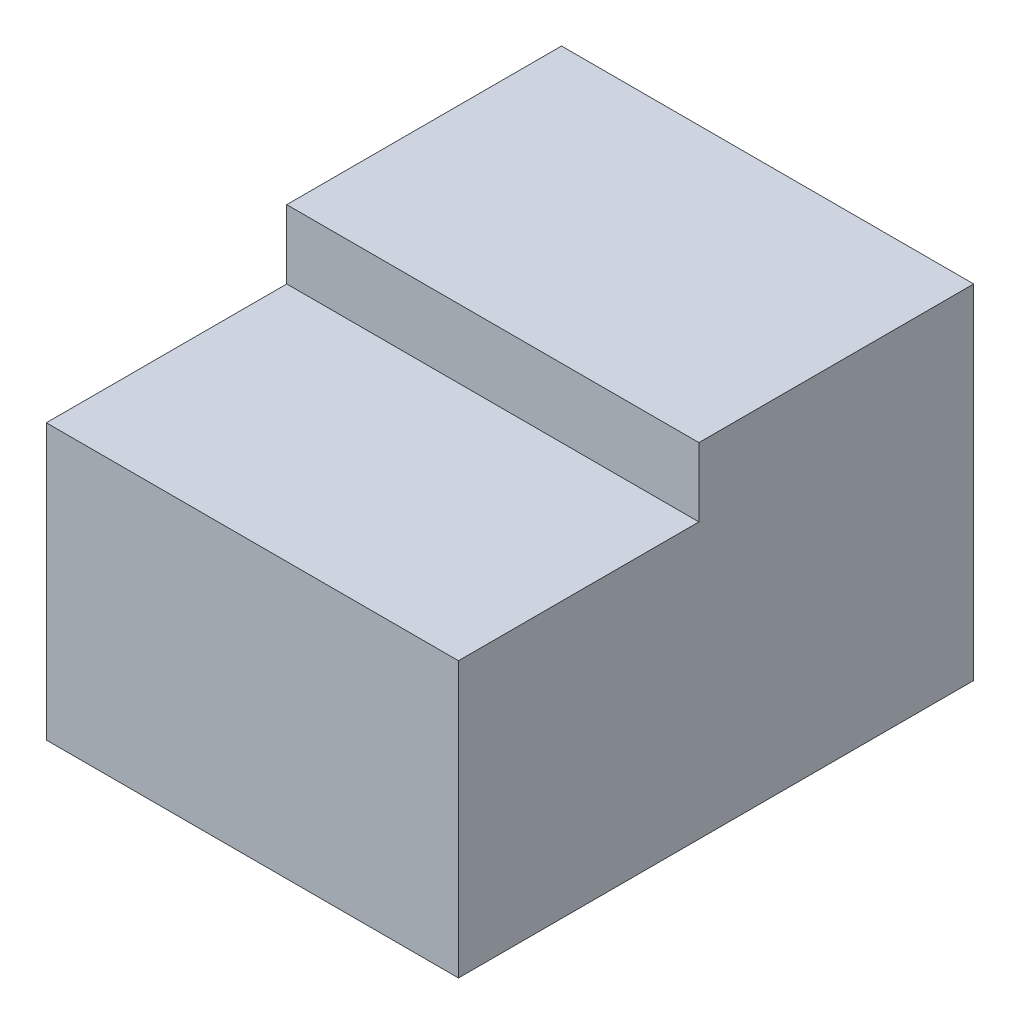
ISO-10303-21;
HEADER;
FILE_DESCRIPTION(('STEP AP214'),'2;1');
FILE_NAME('part.step','',(''),(''),'','','');
FILE_SCHEMA(('AUTOMOTIVE_DESIGN { 1 0 10303 214 1 1 1 1 }'));
ENDSEC;
DATA;
#1=APPLICATION_CONTEXT('core data for automotive mechanical design processes');
#2=APPLICATION_PROTOCOL_DEFINITION('international standard','automotive_design',2000,#1);
#3=PRODUCT_CONTEXT('',#1,'mechanical');
#4=PRODUCT('Part','Part','',(#3));
#5=PRODUCT_RELATED_PRODUCT_CATEGORY('part','',(#4));
#6=PRODUCT_DEFINITION_FORMATION('','',#4);
#7=PRODUCT_DEFINITION_CONTEXT('part definition',#1,'design');
#8=PRODUCT_DEFINITION('design','',#6,#7);
#9=PRODUCT_DEFINITION_SHAPE('','',#8);
#10=(LENGTH_UNIT() NAMED_UNIT(*) SI_UNIT(.MILLI.,.METRE.));
#11=(NAMED_UNIT(*) PLANE_ANGLE_UNIT() SI_UNIT($,.RADIAN.));
#12=(NAMED_UNIT(*) SI_UNIT($,.STERADIAN.) SOLID_ANGLE_UNIT());
#13=UNCERTAINTY_MEASURE_WITH_UNIT(LENGTH_MEASURE(1.E-05),#10,'distance_accuracy_value','');
#14=(GEOMETRIC_REPRESENTATION_CONTEXT(3) GLOBAL_UNCERTAINTY_ASSIGNED_CONTEXT((#13)) GLOBAL_UNIT_ASSIGNED_CONTEXT((#10,
#11,#12)) REPRESENTATION_CONTEXT('',''));
#15=CARTESIAN_POINT('',(0.,0.,0.));
#16=DIRECTION('',(0.,0.,1.));
#17=DIRECTION('',(1.,0.,0.));
#18=AXIS2_PLACEMENT_3D('',#15,#16,#17);
#19=CARTESIAN_POINT('',(12.,10.,0.));
#20=DIRECTION('',(0.,0.,-1.));
#21=DIRECTION('',(0.,1.,0.));
#22=AXIS2_PLACEMENT_3D('',#19,#20,#21);
#23=PLANE('',#22);
#24=DIRECTION('',(-0.5,-0.866025403784439,0.));
#25=VECTOR('',#24,1.);
#26=CARTESIAN_POINT('',(9.17542648054294,5.,0.));
#27=LINE('',#26,#25);
#28=CARTESIAN_POINT('',(9.17542648054294,5.,0.));
#29=VERTEX_POINT('',#28);
#30=CARTESIAN_POINT('',(7.58771324027147,2.25,0.));
#31=VERTEX_POINT('',#30);
#32=EDGE_CURVE('E59',#29,#31,#27,.T.);
#33=ORIENTED_EDGE('',*,*,#32,.F.);
#34=DIRECTION('',(0.5,-0.866025403784439,0.));
#35=VECTOR('',#34,1.);
#36=CARTESIAN_POINT('',(7.58771324027147,7.75,0.));
#37=LINE('',#36,#35);
#38=CARTESIAN_POINT('',(7.58771324027147,7.75,0.));
#39=VERTEX_POINT('',#38);
#40=EDGE_CURVE('E218',#39,#29,#37,.T.);
#41=ORIENTED_EDGE('',*,*,#40,.F.);
#42=DIRECTION('',(1.,0.,0.));
#43=VECTOR('',#42,1.);
#44=CARTESIAN_POINT('',(4.41228675972853,7.75,0.));
#45=LINE('',#44,#43);
#46=CARTESIAN_POINT('',(4.41228675972853,7.75,0.));
#47=VERTEX_POINT('',#46);
#48=EDGE_CURVE('E244',#47,#39,#45,.T.);
#49=ORIENTED_EDGE('',*,*,#48,.F.);
#50=DIRECTION('',(0.5,0.866025403784439,0.));
#51=VECTOR('',#50,1.);
#52=CARTESIAN_POINT('',(2.82457351945706,5.,0.));
#53=LINE('',#52,#51);
#54=CARTESIAN_POINT('',(2.82457351945706,5.,0.));
#55=VERTEX_POINT('',#54);
#56=EDGE_CURVE('E241',#55,#47,#53,.T.);
#57=ORIENTED_EDGE('',*,*,#56,.F.);
#58=DIRECTION('',(-0.5,0.866025403784439,0.));
#59=VECTOR('',#58,1.);
#60=CARTESIAN_POINT('',(4.41228675972853,2.25,0.));
#61=LINE('',#60,#59);
#62=CARTESIAN_POINT('',(4.41228675972853,2.25,0.));
#63=VERTEX_POINT('',#62);
#64=EDGE_CURVE('E238',#63,#55,#61,.T.);
#65=ORIENTED_EDGE('',*,*,#64,.F.);
#66=DIRECTION('',(-1.,0.,0.));
#67=VECTOR('',#66,1.);
#68=CARTESIAN_POINT('',(7.58771324027147,2.25,0.));
#69=LINE('',#68,#67);
#70=EDGE_CURVE('E235',#31,#63,#69,.T.);
#71=ORIENTED_EDGE('',*,*,#70,.F.);
#72=EDGE_LOOP('',(#33,#41,#49,#57,#65,#71));
#73=FACE_BOUND('',#72,.T.);
#74=DIRECTION('',(0.,-1.,0.));
#75=VECTOR('',#74,1.);
#76=CARTESIAN_POINT('',(0.,10.,0.));
#77=LINE('',#76,#75);
#78=CARTESIAN_POINT('',(0.,10.,0.));
#79=VERTEX_POINT('',#78);
#80=CARTESIAN_POINT('',(0.,0.,0.));
#81=VERTEX_POINT('',#80);
#82=EDGE_CURVE('E251',#79,#81,#77,.T.);
#83=ORIENTED_EDGE('',*,*,#82,.F.);
#84=DIRECTION('',(-1.,0.,0.));
#85=VECTOR('',#84,1.);
#86=CARTESIAN_POINT('',(12.,10.,0.));
#87=LINE('',#86,#85);
#88=CARTESIAN_POINT('',(12.,10.,0.));
#89=VERTEX_POINT('',#88);
#90=EDGE_CURVE('E11',#89,#79,#87,.T.);
#91=ORIENTED_EDGE('',*,*,#90,.F.);
#92=DIRECTION('',(0.,-1.,0.));
#93=VECTOR('',#92,1.);
#94=CARTESIAN_POINT('',(12.,10.,0.));
#95=LINE('',#94,#93);
#96=CARTESIAN_POINT('',(12.,0.,0.));
#97=VERTEX_POINT('',#96);
#98=EDGE_CURVE('E261',#89,#97,#95,.T.);
#99=ORIENTED_EDGE('',*,*,#98,.T.);
#100=DIRECTION('',(-1.,0.,0.));
#101=VECTOR('',#100,1.);
#102=CARTESIAN_POINT('',(12.,0.,0.));
#103=LINE('',#102,#101);
#104=EDGE_CURVE('E38',#97,#81,#103,.T.);
#105=ORIENTED_EDGE('',*,*,#104,.T.);
#106=EDGE_LOOP('',(#83,#91,#99,#105));
#107=FACE_BOUND('',#106,.T.);
#108=ADVANCED_FACE('F35',(#73,#107),#23,.T.);
#109=CARTESIAN_POINT('',(12.,10.,8.));
#110=DIRECTION('',(0.,1.,0.));
#111=DIRECTION('',(0.,0.,1.));
#112=AXIS2_PLACEMENT_3D('',#109,#110,#111);
#113=PLANE('',#112);
#114=DIRECTION('',(0.,0.,-1.));
#115=VECTOR('',#114,1.);
#116=CARTESIAN_POINT('',(0.,10.,8.));
#117=LINE('',#116,#115);
#118=CARTESIAN_POINT('',(0.,10.,8.));
#119=VERTEX_POINT('',#118);
#120=EDGE_CURVE('E265',#119,#79,#117,.T.);
#121=ORIENTED_EDGE('',*,*,#120,.F.);
#122=DIRECTION('',(-1.,0.,0.));
#123=VECTOR('',#122,1.);
#124=CARTESIAN_POINT('',(12.,10.,8.));
#125=LINE('',#124,#123);
#126=CARTESIAN_POINT('',(12.,10.,8.));
#127=VERTEX_POINT('',#126);
#128=EDGE_CURVE('E43',#127,#119,#125,.T.);
#129=ORIENTED_EDGE('',*,*,#128,.F.);
#130=DIRECTION('',(0.,0.,-1.));
#131=VECTOR('',#130,1.);
#132=CARTESIAN_POINT('',(12.,10.,8.));
#133=LINE('',#132,#131);
#134=EDGE_CURVE('E277',#127,#89,#133,.T.);
#135=ORIENTED_EDGE('',*,*,#134,.T.);
#136=ORIENTED_EDGE('',*,*,#90,.T.);
#137=EDGE_LOOP('',(#121,#129,#135,#136));
#138=FACE_BOUND('',#137,.T.);
#139=ADVANCED_FACE('F314',(#138),#113,.T.);
#140=CARTESIAN_POINT('',(12.,8.,8.));
#141=DIRECTION('',(0.,0.,1.));
#142=DIRECTION('',(1.,0.,0.));
#143=AXIS2_PLACEMENT_3D('',#140,#141,#142);
#144=PLANE('',#143);
#145=DIRECTION('',(0.,1.,0.));
#146=VECTOR('',#145,1.);
#147=CARTESIAN_POINT('',(0.,8.,8.));
#148=LINE('',#147,#146);
#149=CARTESIAN_POINT('',(0.,8.,8.));
#150=VERTEX_POINT('',#149);
#151=EDGE_CURVE('E291',#150,#119,#148,.T.);
#152=ORIENTED_EDGE('',*,*,#151,.F.);
#153=DIRECTION('',(-1.,0.,0.));
#154=VECTOR('',#153,1.);
#155=CARTESIAN_POINT('',(12.,8.,8.));
#156=LINE('',#155,#154);
#157=CARTESIAN_POINT('',(12.,8.,8.));
#158=VERTEX_POINT('',#157);
#159=EDGE_CURVE('E297',#158,#150,#156,.T.);
#160=ORIENTED_EDGE('',*,*,#159,.F.);
#161=DIRECTION('',(0.,1.,0.));
#162=VECTOR('',#161,1.);
#163=CARTESIAN_POINT('',(12.,8.,8.));
#164=LINE('',#163,#162);
#165=EDGE_CURVE('E274',#158,#127,#164,.T.);
#166=ORIENTED_EDGE('',*,*,#165,.T.);
#167=ORIENTED_EDGE('',*,*,#128,.T.);
#168=EDGE_LOOP('',(#152,#160,#166,#167));
#169=FACE_BOUND('',#168,.T.);
#170=ADVANCED_FACE('F327',(#169),#144,.T.);
#171=CARTESIAN_POINT('',(12.,8.,15.));
#172=DIRECTION('',(0.,1.,0.));
#173=DIRECTION('',(0.,0.,1.));
#174=AXIS2_PLACEMENT_3D('',#171,#172,#173);
#175=PLANE('',#174);
#176=DIRECTION('',(0.,0.,-1.));
#177=VECTOR('',#176,1.);
#178=CARTESIAN_POINT('',(0.,8.,15.));
#179=LINE('',#178,#177);
#180=CARTESIAN_POINT('',(0.,8.,15.));
#181=VERTEX_POINT('',#180);
#182=EDGE_CURVE('E288',#181,#150,#179,.T.);
#183=ORIENTED_EDGE('',*,*,#182,.F.);
#184=DIRECTION('',(-1.,0.,0.));
#185=VECTOR('',#184,1.);
#186=CARTESIAN_POINT('',(12.,8.,15.));
#187=LINE('',#186,#185);
#188=CARTESIAN_POINT('',(12.,8.,15.));
#189=VERTEX_POINT('',#188);
#190=EDGE_CURVE('E299',#189,#181,#187,.T.);
#191=ORIENTED_EDGE('',*,*,#190,.F.);
#192=DIRECTION('',(0.,0.,-1.));
#193=VECTOR('',#192,1.);
#194=CARTESIAN_POINT('',(12.,8.,15.));
#195=LINE('',#194,#193);
#196=EDGE_CURVE('E271',#189,#158,#195,.T.);
#197=ORIENTED_EDGE('',*,*,#196,.T.);
#198=ORIENTED_EDGE('',*,*,#159,.T.);
#199=EDGE_LOOP('',(#183,#191,#197,#198));
#200=FACE_BOUND('',#199,.T.);
#201=ADVANCED_FACE('F325',(#200),#175,.T.);
#202=CARTESIAN_POINT('',(12.,0.,15.));
#203=DIRECTION('',(0.,0.,1.));
#204=DIRECTION('',(1.,0.,0.));
#205=AXIS2_PLACEMENT_3D('',#202,#203,#204);
#206=PLANE('',#205);
#207=DIRECTION('',(0.,1.,0.));
#208=VECTOR('',#207,1.);
#209=CARTESIAN_POINT('',(0.,0.,15.));
#210=LINE('',#209,#208);
#211=CARTESIAN_POINT('',(0.,0.,15.));
#212=VERTEX_POINT('',#211);
#213=EDGE_CURVE('E285',#212,#181,#210,.T.);
#214=ORIENTED_EDGE('',*,*,#213,.F.);
#215=DIRECTION('',(-1.,0.,0.));
#216=VECTOR('',#215,1.);
#217=CARTESIAN_POINT('',(12.,0.,15.));
#218=LINE('',#217,#216);
#219=CARTESIAN_POINT('',(12.,0.,15.));
#220=VERTEX_POINT('',#219);
#221=EDGE_CURVE('E300',#220,#212,#218,.T.);
#222=ORIENTED_EDGE('',*,*,#221,.F.);
#223=DIRECTION('',(0.,1.,0.));
#224=VECTOR('',#223,1.);
#225=CARTESIAN_POINT('',(12.,0.,15.));
#226=LINE('',#225,#224);
#227=EDGE_CURVE('E268',#220,#189,#226,.T.);
#228=ORIENTED_EDGE('',*,*,#227,.T.);
#229=ORIENTED_EDGE('',*,*,#190,.T.);
#230=EDGE_LOOP('',(#214,#222,#228,#229));
#231=FACE_BOUND('',#230,.T.);
#232=ADVANCED_FACE('F322',(#231),#206,.T.);
#233=CARTESIAN_POINT('',(12.,0.,0.));
#234=DIRECTION('',(0.,-1.,0.));
#235=DIRECTION('',(0.,0.,-1.));
#236=AXIS2_PLACEMENT_3D('',#233,#234,#235);
#237=PLANE('',#236);
#238=DIRECTION('',(-0.5,0.,-0.866025403784439));
#239=VECTOR('',#238,1.);
#240=CARTESIAN_POINT('',(4.41228675972853,0.,12.75));
#241=LINE('',#240,#239);
#242=CARTESIAN_POINT('',(4.41228675972853,0.,12.75));
#243=VERTEX_POINT('',#242);
#244=CARTESIAN_POINT('',(2.82457351945706,0.,10.));
#245=VERTEX_POINT('',#244);
#246=EDGE_CURVE('E51',#243,#245,#241,.T.);
#247=ORIENTED_EDGE('',*,*,#246,.F.);
#248=DIRECTION('',(-1.,0.,0.));
#249=VECTOR('',#248,1.);
#250=CARTESIAN_POINT('',(7.58771324027147,0.,12.75));
#251=LINE('',#250,#249);
#252=CARTESIAN_POINT('',(7.58771324027147,0.,12.75));
#253=VERTEX_POINT('',#252);
#254=EDGE_CURVE('E181',#253,#243,#251,.T.);
#255=ORIENTED_EDGE('',*,*,#254,.F.);
#256=DIRECTION('',(-0.5,0.,0.866025403784439));
#257=VECTOR('',#256,1.);
#258=CARTESIAN_POINT('',(9.17542648054294,0.,10.));
#259=LINE('',#258,#257);
#260=CARTESIAN_POINT('',(9.17542648054294,0.,10.));
#261=VERTEX_POINT('',#260);
#262=EDGE_CURVE('E184',#261,#253,#259,.T.);
#263=ORIENTED_EDGE('',*,*,#262,.F.);
#264=DIRECTION('',(0.5,0.,0.866025403784439));
#265=VECTOR('',#264,1.);
#266=CARTESIAN_POINT('',(7.58771324027147,0.,7.25));
#267=LINE('',#266,#265);
#268=CARTESIAN_POINT('',(7.58771324027147,0.,7.25));
#269=VERTEX_POINT('',#268);
#270=EDGE_CURVE('E200',#269,#261,#267,.T.);
#271=ORIENTED_EDGE('',*,*,#270,.F.);
#272=DIRECTION('',(1.,0.,0.));
#273=VECTOR('',#272,1.);
#274=CARTESIAN_POINT('',(4.41228675972853,0.,7.25));
#275=LINE('',#274,#273);
#276=CARTESIAN_POINT('',(4.41228675972853,0.,7.25));
#277=VERTEX_POINT('',#276);
#278=EDGE_CURVE('E197',#277,#269,#275,.T.);
#279=ORIENTED_EDGE('',*,*,#278,.F.);
#280=DIRECTION('',(0.5,0.,-0.866025403784439));
#281=VECTOR('',#280,1.);
#282=CARTESIAN_POINT('',(2.82457351945706,0.,10.));
#283=LINE('',#282,#281);
#284=EDGE_CURVE('E195',#245,#277,#283,.T.);
#285=ORIENTED_EDGE('',*,*,#284,.F.);
#286=EDGE_LOOP('',(#247,#255,#263,#271,#279,#285));
#287=FACE_BOUND('',#286,.T.);
#288=DIRECTION('',(0.,0.,1.));
#289=VECTOR('',#288,1.);
#290=CARTESIAN_POINT('',(0.,0.,0.));
#291=LINE('',#290,#289);
#292=EDGE_CURVE('E282',#81,#212,#291,.T.);
#293=ORIENTED_EDGE('',*,*,#292,.F.);
#294=ORIENTED_EDGE('',*,*,#104,.F.);
#295=DIRECTION('',(0.,0.,1.));
#296=VECTOR('',#295,1.);
#297=CARTESIAN_POINT('',(12.,0.,0.));
#298=LINE('',#297,#296);
#299=EDGE_CURVE('E264',#97,#220,#298,.T.);
#300=ORIENTED_EDGE('',*,*,#299,.T.);
#301=ORIENTED_EDGE('',*,*,#221,.T.);
#302=EDGE_LOOP('',(#293,#294,#300,#301));
#303=FACE_BOUND('',#302,.T.);
#304=ADVANCED_FACE('F308',(#287,#303),#237,.T.);
#305=CARTESIAN_POINT('',(12.,0.,0.));
#306=DIRECTION('',(-1.,0.,0.));
#307=DIRECTION('',(0.,0.,1.));
#308=AXIS2_PLACEMENT_3D('',#305,#306,#307);
#309=PLANE('',#308);
#310=ORIENTED_EDGE('',*,*,#98,.F.);
#311=ORIENTED_EDGE('',*,*,#134,.F.);
#312=ORIENTED_EDGE('',*,*,#165,.F.);
#313=ORIENTED_EDGE('',*,*,#196,.F.);
#314=ORIENTED_EDGE('',*,*,#227,.F.);
#315=ORIENTED_EDGE('',*,*,#299,.F.);
#316=EDGE_LOOP('',(#310,#311,#312,#313,#314,#315));
#317=FACE_BOUND('',#316,.T.);
#318=ADVANCED_FACE('F317',(#317),#309,.F.);
#319=CARTESIAN_POINT('',(0.,0.,0.));
#320=DIRECTION('',(-1.,0.,0.));
#321=DIRECTION('',(0.,0.,1.));
#322=AXIS2_PLACEMENT_3D('',#319,#320,#321);
#323=PLANE('',#322);
#324=ORIENTED_EDGE('',*,*,#82,.T.);
#325=ORIENTED_EDGE('',*,*,#292,.T.);
#326=ORIENTED_EDGE('',*,*,#213,.T.);
#327=ORIENTED_EDGE('',*,*,#182,.T.);
#328=ORIENTED_EDGE('',*,*,#151,.T.);
#329=ORIENTED_EDGE('',*,*,#120,.T.);
#330=EDGE_LOOP('',(#324,#325,#326,#327,#328,#329));
#331=FACE_BOUND('',#330,.T.);
#332=ADVANCED_FACE('F310',(#331),#323,.T.);
#333=CARTESIAN_POINT('',(9.17542648054294,5.,5.));
#334=DIRECTION('',(0.866025403784439,-0.5,0.));
#335=DIRECTION('',(0.5,0.866025403784439,0.));
#336=AXIS2_PLACEMENT_3D('',#333,#334,#335);
#337=PLANE('',#336);
#338=ORIENTED_EDGE('',*,*,#32,.T.);
#339=DIRECTION('',(0.,0.,-1.));
#340=VECTOR('',#339,1.);
#341=CARTESIAN_POINT('',(7.58771324027147,2.25,5.));
#342=LINE('',#341,#340);
#343=CARTESIAN_POINT('',(7.58771324027147,2.25,5.));
#344=VERTEX_POINT('',#343);
#345=EDGE_CURVE('E233',#344,#31,#342,.T.);
#346=ORIENTED_EDGE('',*,*,#345,.F.);
#347=DIRECTION('',(-0.5,-0.866025403784439,0.));
#348=VECTOR('',#347,1.);
#349=CARTESIAN_POINT('',(9.17542648054294,5.,5.));
#350=LINE('',#349,#348);
#351=CARTESIAN_POINT('',(9.17542648054294,5.,5.));
#352=VERTEX_POINT('',#351);
#353=EDGE_CURVE('E214',#352,#344,#350,.T.);
#354=ORIENTED_EDGE('',*,*,#353,.F.);
#355=DIRECTION('',(0.,0.,-1.));
#356=VECTOR('',#355,1.);
#357=CARTESIAN_POINT('',(9.17542648054294,5.,5.));
#358=LINE('',#357,#356);
#359=EDGE_CURVE('E249',#352,#29,#358,.T.);
#360=ORIENTED_EDGE('',*,*,#359,.T.);
#361=EDGE_LOOP('',(#338,#346,#354,#360));
#362=FACE_BOUND('',#361,.T.);
#363=ADVANCED_FACE('F350',(#362),#337,.F.);
#364=CARTESIAN_POINT('',(7.58771324027147,7.75,5.));
#365=DIRECTION('',(0.866025403784439,0.5,0.));
#366=DIRECTION('',(-0.5,0.866025403784439,0.));
#367=AXIS2_PLACEMENT_3D('',#364,#365,#366);
#368=PLANE('',#367);
#369=ORIENTED_EDGE('',*,*,#40,.T.);
#370=ORIENTED_EDGE('',*,*,#359,.F.);
#371=DIRECTION('',(0.5,-0.866025403784439,0.));
#372=VECTOR('',#371,1.);
#373=CARTESIAN_POINT('',(7.58771324027147,7.75,5.));
#374=LINE('',#373,#372);
#375=CARTESIAN_POINT('',(7.58771324027147,7.75,5.));
#376=VERTEX_POINT('',#375);
#377=EDGE_CURVE('E230',#376,#352,#374,.T.);
#378=ORIENTED_EDGE('',*,*,#377,.F.);
#379=DIRECTION('',(0.,0.,-1.));
#380=VECTOR('',#379,1.);
#381=CARTESIAN_POINT('',(7.58771324027147,7.75,5.));
#382=LINE('',#381,#380);
#383=EDGE_CURVE('E252',#376,#39,#382,.T.);
#384=ORIENTED_EDGE('',*,*,#383,.T.);
#385=EDGE_LOOP('',(#369,#370,#378,#384));
#386=FACE_BOUND('',#385,.T.);
#387=ADVANCED_FACE('F356',(#386),#368,.F.);
#388=CARTESIAN_POINT('',(4.41228675972853,7.75,5.));
#389=DIRECTION('',(0.,1.,0.));
#390=DIRECTION('',(0.,0.,1.));
#391=AXIS2_PLACEMENT_3D('',#388,#389,#390);
#392=PLANE('',#391);
#393=ORIENTED_EDGE('',*,*,#48,.T.);
#394=ORIENTED_EDGE('',*,*,#383,.F.);
#395=DIRECTION('',(1.,0.,0.));
#396=VECTOR('',#395,1.);
#397=CARTESIAN_POINT('',(4.41228675972853,7.75,5.));
#398=LINE('',#397,#396);
#399=CARTESIAN_POINT('',(4.41228675972853,7.75,5.));
#400=VERTEX_POINT('',#399);
#401=EDGE_CURVE('E227',#400,#376,#398,.T.);
#402=ORIENTED_EDGE('',*,*,#401,.F.);
#403=DIRECTION('',(0.,0.,-1.));
#404=VECTOR('',#403,1.);
#405=CARTESIAN_POINT('',(4.41228675972853,7.75,5.));
#406=LINE('',#405,#404);
#407=EDGE_CURVE('E254',#400,#47,#406,.T.);
#408=ORIENTED_EDGE('',*,*,#407,.T.);
#409=EDGE_LOOP('',(#393,#394,#402,#408));
#410=FACE_BOUND('',#409,.T.);
#411=ADVANCED_FACE('F358',(#410),#392,.F.);
#412=CARTESIAN_POINT('',(2.82457351945706,5.,5.));
#413=DIRECTION('',(-0.866025403784439,0.5,0.));
#414=DIRECTION('',(-0.5,-0.866025403784439,0.));
#415=AXIS2_PLACEMENT_3D('',#412,#413,#414);
#416=PLANE('',#415);
#417=ORIENTED_EDGE('',*,*,#56,.T.);
#418=ORIENTED_EDGE('',*,*,#407,.F.);
#419=DIRECTION('',(0.5,0.866025403784439,0.));
#420=VECTOR('',#419,1.);
#421=CARTESIAN_POINT('',(2.82457351945706,5.,5.));
#422=LINE('',#421,#420);
#423=CARTESIAN_POINT('',(2.82457351945706,5.,5.));
#424=VERTEX_POINT('',#423);
#425=EDGE_CURVE('E224',#424,#400,#422,.T.);
#426=ORIENTED_EDGE('',*,*,#425,.F.);
#427=DIRECTION('',(0.,0.,-1.));
#428=VECTOR('',#427,1.);
#429=CARTESIAN_POINT('',(2.82457351945706,5.,5.));
#430=LINE('',#429,#428);
#431=EDGE_CURVE('E256',#424,#55,#430,.T.);
#432=ORIENTED_EDGE('',*,*,#431,.T.);
#433=EDGE_LOOP('',(#417,#418,#426,#432));
#434=FACE_BOUND('',#433,.T.);
#435=ADVANCED_FACE('F360',(#434),#416,.F.);
#436=CARTESIAN_POINT('',(4.41228675972853,2.25,5.));
#437=DIRECTION('',(-0.866025403784439,-0.5,0.));
#438=DIRECTION('',(0.5,-0.866025403784439,0.));
#439=AXIS2_PLACEMENT_3D('',#436,#437,#438);
#440=PLANE('',#439);
#441=ORIENTED_EDGE('',*,*,#64,.T.);
#442=ORIENTED_EDGE('',*,*,#431,.F.);
#443=DIRECTION('',(-0.5,0.866025403784439,0.));
#444=VECTOR('',#443,1.);
#445=CARTESIAN_POINT('',(4.41228675972853,2.25,5.));
#446=LINE('',#445,#444);
#447=CARTESIAN_POINT('',(4.41228675972853,2.25,5.));
#448=VERTEX_POINT('',#447);
#449=EDGE_CURVE('E221',#448,#424,#446,.T.);
#450=ORIENTED_EDGE('',*,*,#449,.F.);
#451=DIRECTION('',(0.,0.,-1.));
#452=VECTOR('',#451,1.);
#453=CARTESIAN_POINT('',(4.41228675972853,2.25,5.));
#454=LINE('',#453,#452);
#455=EDGE_CURVE('E258',#448,#63,#454,.T.);
#456=ORIENTED_EDGE('',*,*,#455,.T.);
#457=EDGE_LOOP('',(#441,#442,#450,#456));
#458=FACE_BOUND('',#457,.T.);
#459=ADVANCED_FACE('F363',(#458),#440,.F.);
#460=CARTESIAN_POINT('',(7.58771324027147,2.25,5.));
#461=DIRECTION('',(0.,-1.,0.));
#462=DIRECTION('',(0.,0.,-1.));
#463=AXIS2_PLACEMENT_3D('',#460,#461,#462);
#464=PLANE('',#463);
#465=ORIENTED_EDGE('',*,*,#70,.T.);
#466=ORIENTED_EDGE('',*,*,#455,.F.);
#467=DIRECTION('',(-1.,0.,0.));
#468=VECTOR('',#467,1.);
#469=CARTESIAN_POINT('',(7.58771324027147,2.25,5.));
#470=LINE('',#469,#468);
#471=EDGE_CURVE('E217',#344,#448,#470,.T.);
#472=ORIENTED_EDGE('',*,*,#471,.F.);
#473=ORIENTED_EDGE('',*,*,#345,.T.);
#474=EDGE_LOOP('',(#465,#466,#472,#473));
#475=FACE_BOUND('',#474,.T.);
#476=ADVANCED_FACE('F346',(#475),#464,.F.);
#477=CARTESIAN_POINT('',(0.,0.,5.));
#478=DIRECTION('',(0.,0.,-1.));
#479=DIRECTION('',(0.,1.,0.));
#480=AXIS2_PLACEMENT_3D('',#477,#478,#479);
#481=PLANE('',#480);
#482=ORIENTED_EDGE('',*,*,#353,.T.);
#483=ORIENTED_EDGE('',*,*,#471,.T.);
#484=ORIENTED_EDGE('',*,*,#449,.T.);
#485=ORIENTED_EDGE('',*,*,#425,.T.);
#486=ORIENTED_EDGE('',*,*,#401,.T.);
#487=ORIENTED_EDGE('',*,*,#377,.T.);
#488=EDGE_LOOP('',(#482,#483,#484,#485,#486,#487));
#489=FACE_BOUND('',#488,.T.);
#490=ADVANCED_FACE('F353',(#489),#481,.T.);
#491=CARTESIAN_POINT('',(4.41228675972853,5.,12.75));
#492=DIRECTION('',(-0.866025403784439,0.,0.5));
#493=DIRECTION('',(0.5,0.,0.866025403784439));
#494=AXIS2_PLACEMENT_3D('',#491,#492,#493);
#495=PLANE('',#494);
#496=ORIENTED_EDGE('',*,*,#246,.T.);
#497=DIRECTION('',(0.,-1.,0.));
#498=VECTOR('',#497,1.);
#499=CARTESIAN_POINT('',(2.82457351945706,5.,10.));
#500=LINE('',#499,#498);
#501=CARTESIAN_POINT('',(2.82457351945706,5.,10.));
#502=VERTEX_POINT('',#501);
#503=EDGE_CURVE('E158',#502,#245,#500,.T.);
#504=ORIENTED_EDGE('',*,*,#503,.F.);
#505=DIRECTION('',(-0.5,0.,-0.866025403784439));
#506=VECTOR('',#505,1.);
#507=CARTESIAN_POINT('',(4.41228675972853,5.,12.75));
#508=LINE('',#507,#506);
#509=CARTESIAN_POINT('',(4.41228675972853,5.,12.75));
#510=VERTEX_POINT('',#509);
#511=EDGE_CURVE('E162',#510,#502,#508,.T.);
#512=ORIENTED_EDGE('',*,*,#511,.F.);
#513=DIRECTION('',(0.,-1.,0.));
#514=VECTOR('',#513,1.);
#515=CARTESIAN_POINT('',(4.41228675972853,5.,12.75));
#516=LINE('',#515,#514);
#517=EDGE_CURVE('E205',#510,#243,#516,.T.);
#518=ORIENTED_EDGE('',*,*,#517,.T.);
#519=EDGE_LOOP('',(#496,#504,#512,#518));
#520=FACE_BOUND('',#519,.T.);
#521=ADVANCED_FACE('F160',(#520),#495,.F.);
#522=CARTESIAN_POINT('',(7.58771324027147,5.,12.75));
#523=DIRECTION('',(0.,0.,1.));
#524=DIRECTION('',(1.,0.,0.));
#525=AXIS2_PLACEMENT_3D('',#522,#523,#524);
#526=PLANE('',#525);
#527=ORIENTED_EDGE('',*,*,#254,.T.);
#528=ORIENTED_EDGE('',*,*,#517,.F.);
#529=DIRECTION('',(-1.,0.,0.));
#530=VECTOR('',#529,1.);
#531=CARTESIAN_POINT('',(7.58771324027147,5.,12.75));
#532=LINE('',#531,#530);
#533=CARTESIAN_POINT('',(7.58771324027147,5.,12.75));
#534=VERTEX_POINT('',#533);
#535=EDGE_CURVE('E168',#534,#510,#532,.T.);
#536=ORIENTED_EDGE('',*,*,#535,.F.);
#537=DIRECTION('',(0.,-1.,0.));
#538=VECTOR('',#537,1.);
#539=CARTESIAN_POINT('',(7.58771324027147,5.,12.75));
#540=LINE('',#539,#538);
#541=EDGE_CURVE('E207',#534,#253,#540,.T.);
#542=ORIENTED_EDGE('',*,*,#541,.T.);
#543=EDGE_LOOP('',(#527,#528,#536,#542));
#544=FACE_BOUND('',#543,.T.);
#545=ADVANCED_FACE('F440',(#544),#526,.F.);
#546=CARTESIAN_POINT('',(9.17542648054294,5.,10.));
#547=DIRECTION('',(0.866025403784439,0.,0.5));
#548=DIRECTION('',(0.5,0.,-0.866025403784439));
#549=AXIS2_PLACEMENT_3D('',#546,#547,#548);
#550=PLANE('',#549);
#551=ORIENTED_EDGE('',*,*,#262,.T.);
#552=ORIENTED_EDGE('',*,*,#541,.F.);
#553=DIRECTION('',(-0.5,0.,0.866025403784439));
#554=VECTOR('',#553,1.);
#555=CARTESIAN_POINT('',(9.17542648054294,5.,10.));
#556=LINE('',#555,#554);
#557=CARTESIAN_POINT('',(9.17542648054294,5.,10.));
#558=VERTEX_POINT('',#557);
#559=EDGE_CURVE('E191',#558,#534,#556,.T.);
#560=ORIENTED_EDGE('',*,*,#559,.F.);
#561=DIRECTION('',(0.,-1.,0.));
#562=VECTOR('',#561,1.);
#563=CARTESIAN_POINT('',(9.17542648054294,5.,10.));
#564=LINE('',#563,#562);
#565=EDGE_CURVE('E209',#558,#261,#564,.T.);
#566=ORIENTED_EDGE('',*,*,#565,.T.);
#567=EDGE_LOOP('',(#551,#552,#560,#566));
#568=FACE_BOUND('',#567,.T.);
#569=ADVANCED_FACE('F449',(#568),#550,.F.);
#570=CARTESIAN_POINT('',(7.58771324027147,5.,7.25));
#571=DIRECTION('',(0.866025403784439,0.,-0.5));
#572=DIRECTION('',(-0.5,0.,-0.866025403784439));
#573=AXIS2_PLACEMENT_3D('',#570,#571,#572);
#574=PLANE('',#573);
#575=ORIENTED_EDGE('',*,*,#270,.T.);
#576=ORIENTED_EDGE('',*,*,#565,.F.);
#577=DIRECTION('',(0.5,0.,0.866025403784439));
#578=VECTOR('',#577,1.);
#579=CARTESIAN_POINT('',(7.58771324027147,5.,7.25));
#580=LINE('',#579,#578);
#581=CARTESIAN_POINT('',(7.58771324027147,5.,7.25));
#582=VERTEX_POINT('',#581);
#583=EDGE_CURVE('E188',#582,#558,#580,.T.);
#584=ORIENTED_EDGE('',*,*,#583,.F.);
#585=DIRECTION('',(0.,-1.,0.));
#586=VECTOR('',#585,1.);
#587=CARTESIAN_POINT('',(7.58771324027147,5.,7.25));
#588=LINE('',#587,#586);
#589=EDGE_CURVE('E211',#582,#269,#588,.T.);
#590=ORIENTED_EDGE('',*,*,#589,.T.);
#591=EDGE_LOOP('',(#575,#576,#584,#590));
#592=FACE_BOUND('',#591,.T.);
#593=ADVANCED_FACE('F459',(#592),#574,.F.);
#594=CARTESIAN_POINT('',(4.41228675972853,5.,7.25));
#595=DIRECTION('',(0.,0.,-1.));
#596=DIRECTION('',(-1.,0.,0.));
#597=AXIS2_PLACEMENT_3D('',#594,#595,#596);
#598=PLANE('',#597);
#599=ORIENTED_EDGE('',*,*,#278,.T.);
#600=ORIENTED_EDGE('',*,*,#589,.F.);
#601=DIRECTION('',(1.,0.,0.));
#602=VECTOR('',#601,1.);
#603=CARTESIAN_POINT('',(4.41228675972853,5.,7.25));
#604=LINE('',#603,#602);
#605=CARTESIAN_POINT('',(4.41228675972853,5.,7.25));
#606=VERTEX_POINT('',#605);
#607=EDGE_CURVE('E176',#606,#582,#604,.T.);
#608=ORIENTED_EDGE('',*,*,#607,.F.);
#609=DIRECTION('',(0.,-1.,0.));
#610=VECTOR('',#609,1.);
#611=CARTESIAN_POINT('',(4.41228675972853,5.,7.25));
#612=LINE('',#611,#610);
#613=EDGE_CURVE('E167',#606,#277,#612,.T.);
#614=ORIENTED_EDGE('',*,*,#613,.T.);
#615=EDGE_LOOP('',(#599,#600,#608,#614));
#616=FACE_BOUND('',#615,.T.);
#617=ADVANCED_FACE('F469',(#616),#598,.F.);
#618=CARTESIAN_POINT('',(2.82457351945706,5.,10.));
#619=DIRECTION('',(-0.866025403784439,0.,-0.5));
#620=DIRECTION('',(-0.5,0.,0.866025403784439));
#621=AXIS2_PLACEMENT_3D('',#618,#619,#620);
#622=PLANE('',#621);
#623=ORIENTED_EDGE('',*,*,#284,.T.);
#624=ORIENTED_EDGE('',*,*,#613,.F.);
#625=DIRECTION('',(0.5,0.,-0.866025403784439));
#626=VECTOR('',#625,1.);
#627=CARTESIAN_POINT('',(2.82457351945706,5.,10.));
#628=LINE('',#627,#626);
#629=EDGE_CURVE('E171',#502,#606,#628,.T.);
#630=ORIENTED_EDGE('',*,*,#629,.F.);
#631=ORIENTED_EDGE('',*,*,#503,.T.);
#632=EDGE_LOOP('',(#623,#624,#630,#631));
#633=FACE_BOUND('',#632,.T.);
#634=ADVANCED_FACE('F172',(#633),#622,.F.);
#635=CARTESIAN_POINT('',(0.,5.,0.));
#636=DIRECTION('',(0.,-1.,0.));
#637=DIRECTION('',(0.,0.,-1.));
#638=AXIS2_PLACEMENT_3D('',#635,#636,#637);
#639=PLANE('',#638);
#640=ORIENTED_EDGE('',*,*,#511,.T.);
#641=ORIENTED_EDGE('',*,*,#629,.T.);
#642=ORIENTED_EDGE('',*,*,#607,.T.);
#643=ORIENTED_EDGE('',*,*,#583,.T.);
#644=ORIENTED_EDGE('',*,*,#559,.T.);
#645=ORIENTED_EDGE('',*,*,#535,.T.);
#646=EDGE_LOOP('',(#640,#641,#642,#643,#644,#645));
#647=FACE_BOUND('',#646,.T.);
#648=ADVANCED_FACE('F178',(#647),#639,.T.);
#649=CLOSED_SHELL('',(#108,#139,#170,#201,#232,#304,#318,#332,#363,#387,#411,#435,#459,#476,
#490,#521,#545,#569,#593,#617,#634,#648));
#650=MANIFOLD_SOLID_BREP('B2',#649);
#651=ADVANCED_BREP_SHAPE_REPRESENTATION('',(#18,#650),#14);
#652=SHAPE_DEFINITION_REPRESENTATION(#9,#651);
ENDSEC;
END-ISO-10303-21;
